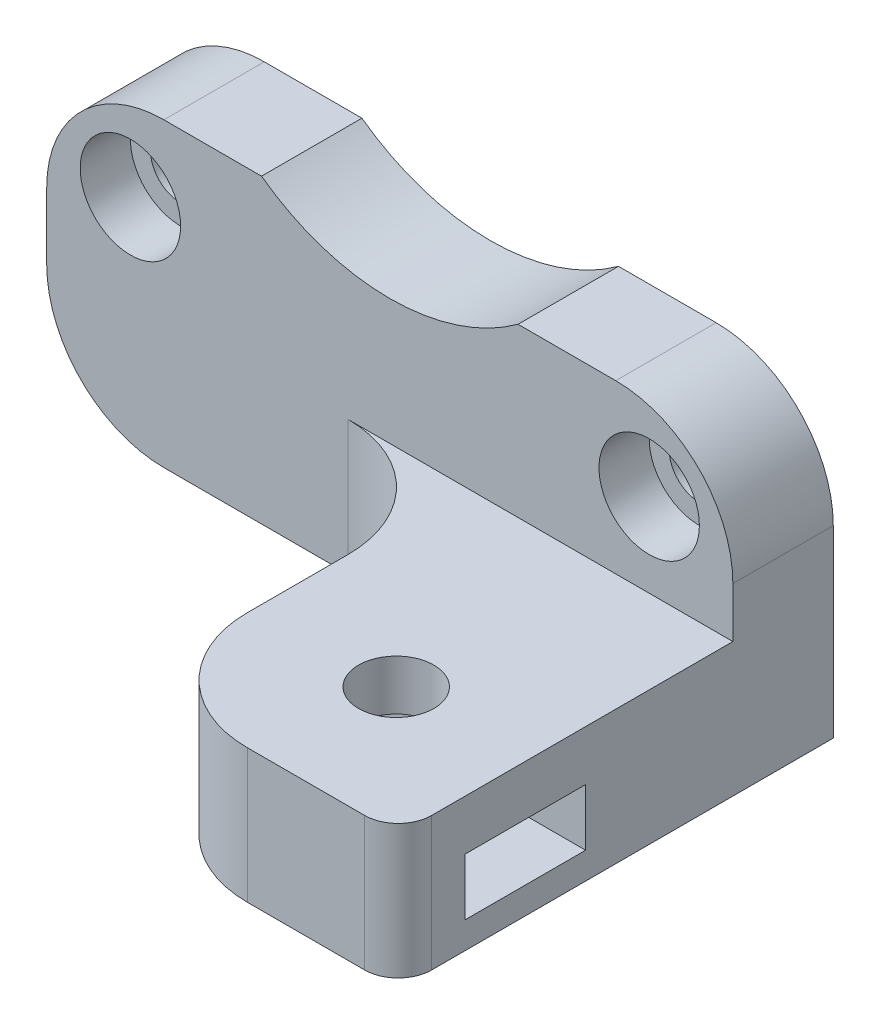
ISO-10303-21;
HEADER;
FILE_DESCRIPTION(('STEP AP214'),'2;1');
FILE_NAME('part.step','',(''),(''),'','','');
FILE_SCHEMA(('AUTOMOTIVE_DESIGN { 1 0 10303 214 1 1 1 1 }'));
ENDSEC;
DATA;
#1=APPLICATION_CONTEXT('core data for automotive mechanical design processes');
#2=APPLICATION_PROTOCOL_DEFINITION('international standard','automotive_design',2000,#1);
#3=PRODUCT_CONTEXT('',#1,'mechanical');
#4=PRODUCT('Part','Part','',(#3));
#5=PRODUCT_RELATED_PRODUCT_CATEGORY('part','',(#4));
#6=PRODUCT_DEFINITION_FORMATION('','',#4);
#7=PRODUCT_DEFINITION_CONTEXT('part definition',#1,'design');
#8=PRODUCT_DEFINITION('design','',#6,#7);
#9=PRODUCT_DEFINITION_SHAPE('','',#8);
#10=(LENGTH_UNIT() NAMED_UNIT(*) SI_UNIT(.MILLI.,.METRE.));
#11=(NAMED_UNIT(*) PLANE_ANGLE_UNIT() SI_UNIT($,.RADIAN.));
#12=(NAMED_UNIT(*) SI_UNIT($,.STERADIAN.) SOLID_ANGLE_UNIT());
#13=UNCERTAINTY_MEASURE_WITH_UNIT(LENGTH_MEASURE(1.E-05),#10,'distance_accuracy_value','');
#14=(GEOMETRIC_REPRESENTATION_CONTEXT(3) GLOBAL_UNCERTAINTY_ASSIGNED_CONTEXT((#13)) GLOBAL_UNIT_ASSIGNED_CONTEXT((#10,
#11,#12)) REPRESENTATION_CONTEXT('',''));
#15=CARTESIAN_POINT('',(0.,0.,0.));
#16=DIRECTION('',(0.,0.,1.));
#17=DIRECTION('',(1.,0.,0.));
#18=AXIS2_PLACEMENT_3D('',#15,#16,#17);
#19=CARTESIAN_POINT('',(41.,0.,0.));
#20=DIRECTION('',(1.,0.,0.));
#21=DIRECTION('',(0.,0.,-1.));
#22=AXIS2_PLACEMENT_3D('',#19,#20,#21);
#23=PLANE('',#22);
#24=DIRECTION('',(0.,-1.,0.));
#25=VECTOR('',#24,1.);
#26=CARTESIAN_POINT('',(41.,10.,-6.));
#27=LINE('',#26,#25);
#28=CARTESIAN_POINT('',(41.,3.,-6.));
#29=VERTEX_POINT('',#28);
#30=CARTESIAN_POINT('',(41.,-8.,-6.));
#31=VERTEX_POINT('',#30);
#32=EDGE_CURVE('E274',#29,#31,#27,.T.);
#33=ORIENTED_EDGE('',*,*,#32,.F.);
#34=DIRECTION('',(0.,0.,-1.));
#35=VECTOR('',#34,1.);
#36=CARTESIAN_POINT('',(41.,3.,0.));
#37=LINE('',#36,#35);
#38=CARTESIAN_POINT('',(41.,3.,0.));
#39=VERTEX_POINT('',#38);
#40=EDGE_CURVE('E340',#29,#39,#37,.F.);
#41=ORIENTED_EDGE('',*,*,#40,.T.);
#42=DIRECTION('',(0.,1.,0.));
#43=VECTOR('',#42,1.);
#44=CARTESIAN_POINT('',(41.,0.,0.));
#45=LINE('',#44,#43);
#46=CARTESIAN_POINT('',(41.,0.,0.));
#47=VERTEX_POINT('',#46);
#48=EDGE_CURVE('E270',#47,#39,#45,.T.);
#49=ORIENTED_EDGE('',*,*,#48,.F.);
#50=DIRECTION('',(0.,0.,-1.));
#51=VECTOR('',#50,1.);
#52=CARTESIAN_POINT('',(41.,0.,20.));
#53=LINE('',#52,#51);
#54=CARTESIAN_POINT('',(41.,0.,18.));
#55=VERTEX_POINT('',#54);
#56=EDGE_CURVE('E268',#55,#47,#53,.T.);
#57=ORIENTED_EDGE('',*,*,#56,.F.);
#58=DIRECTION('',(0.,1.,0.));
#59=VECTOR('',#58,1.);
#60=CARTESIAN_POINT('',(41.,0.,18.));
#61=LINE('',#60,#59);
#62=CARTESIAN_POINT('',(41.,-8.,18.));
#63=VERTEX_POINT('',#62);
#64=EDGE_CURVE('E307',#55,#63,#61,.F.);
#65=ORIENTED_EDGE('',*,*,#64,.T.);
#66=DIRECTION('',(0.,0.,1.));
#67=VECTOR('',#66,1.);
#68=CARTESIAN_POINT('',(41.,-8.,-6.));
#69=LINE('',#68,#67);
#70=EDGE_CURVE('E276',#31,#63,#69,.T.);
#71=ORIENTED_EDGE('',*,*,#70,.F.);
#72=EDGE_LOOP('',(#33,#41,#49,#57,#65,#71));
#73=FACE_BOUND('',#72,.T.);
#74=DIRECTION('',(0.,1.,0.));
#75=VECTOR('',#74,1.);
#76=CARTESIAN_POINT('',(41.,-6.4,8.8));
#77=LINE('',#76,#75);
#78=CARTESIAN_POINT('',(41.,-6.4,8.8));
#79=VERTEX_POINT('',#78);
#80=CARTESIAN_POINT('',(41.,-3.,8.8));
#81=VERTEX_POINT('',#80);
#82=EDGE_CURVE('E227',#79,#81,#77,.T.);
#83=ORIENTED_EDGE('',*,*,#82,.F.);
#84=DIRECTION('',(0.,0.,-1.));
#85=VECTOR('',#84,1.);
#86=CARTESIAN_POINT('',(41.,-6.4,0.));
#87=LINE('',#86,#85);
#88=CARTESIAN_POINT('',(41.,-6.4,16.));
#89=VERTEX_POINT('',#88);
#90=EDGE_CURVE('E191',#89,#79,#87,.T.);
#91=ORIENTED_EDGE('',*,*,#90,.F.);
#92=DIRECTION('',(0.,1.,0.));
#93=VECTOR('',#92,1.);
#94=CARTESIAN_POINT('',(41.,-6.4,16.));
#95=LINE('',#94,#93);
#96=CARTESIAN_POINT('',(41.,-3.,16.));
#97=VERTEX_POINT('',#96);
#98=EDGE_CURVE('E181',#89,#97,#95,.T.);
#99=ORIENTED_EDGE('',*,*,#98,.T.);
#100=DIRECTION('',(0.,0.,-1.));
#101=VECTOR('',#100,1.);
#102=CARTESIAN_POINT('',(41.,-3.,0.));
#103=LINE('',#102,#101);
#104=EDGE_CURVE('E214',#97,#81,#103,.T.);
#105=ORIENTED_EDGE('',*,*,#104,.T.);
#106=EDGE_LOOP('',(#83,#91,#99,#105));
#107=FACE_BOUND('',#106,.T.);
#108=ADVANCED_FACE('F33',(#73,#107),#23,.T.);
#109=CARTESIAN_POINT('',(33.2837910699482,0.,12.4));
#110=DIRECTION('',(0.,1.,0.));
#111=DIRECTION('',(0.,0.,1.));
#112=AXIS2_PLACEMENT_3D('',#109,#110,#111);
#113=CYLINDRICAL_SURFACE('',#112,2.25);
#114=CARTESIAN_POINT('',(33.2837910699482,-8.,12.4));
#115=DIRECTION('',(0.,1.,0.));
#116=DIRECTION('',(0.,0.,1.));
#117=AXIS2_PLACEMENT_3D('',#114,#115,#116);
#118=CIRCLE('',#117,2.25);
#119=CARTESIAN_POINT('',(33.2837910699482,-8.,14.65));
#120=VERTEX_POINT('',#119);
#121=EDGE_CURVE('E247',#120,#120,#118,.T.);
#122=ORIENTED_EDGE('',*,*,#121,.F.);
#123=EDGE_LOOP('',(#122));
#124=FACE_BOUND('',#123,.T.);
#125=CARTESIAN_POINT('',(33.2837910699482,-6.4,12.4));
#126=DIRECTION('',(0.,1.,0.));
#127=DIRECTION('',(0.,0.,1.));
#128=AXIS2_PLACEMENT_3D('',#125,#126,#127);
#129=CIRCLE('',#128,2.25);
#130=CARTESIAN_POINT('',(33.2837910699482,-6.4,14.65));
#131=VERTEX_POINT('',#130);
#132=EDGE_CURVE('E196',#131,#131,#129,.F.);
#133=ORIENTED_EDGE('',*,*,#132,.F.);
#134=EDGE_LOOP('',(#133));
#135=FACE_BOUND('',#134,.T.);
#136=ADVANCED_FACE('F418',(#124,#135),#113,.F.);
#137=CARTESIAN_POINT('',(36.0000000000001,5.00000000000001,-6.));
#138=DIRECTION('',(0.,0.,1.));
#139=DIRECTION('',(1.,0.,0.));
#140=AXIS2_PLACEMENT_3D('',#137,#138,#139);
#141=CYLINDRICAL_SURFACE('',#140,1.8);
#142=CARTESIAN_POINT('',(36.0000000000001,5.00000000000001,-6.));
#143=DIRECTION('',(0.,0.,1.));
#144=DIRECTION('',(1.,0.,0.));
#145=AXIS2_PLACEMENT_3D('',#142,#143,#144);
#146=CIRCLE('',#145,1.8);
#147=CARTESIAN_POINT('',(37.8000000000001,5.00000000000001,-6.));
#148=VERTEX_POINT('',#147);
#149=EDGE_CURVE('E251',#148,#148,#146,.T.);
#150=ORIENTED_EDGE('',*,*,#149,.F.);
#151=EDGE_LOOP('',(#150));
#152=FACE_BOUND('',#151,.T.);
#153=CARTESIAN_POINT('',(36.0000000000001,5.00000000000001,-3.));
#154=DIRECTION('',(0.,0.,1.));
#155=DIRECTION('',(1.,0.,0.));
#156=AXIS2_PLACEMENT_3D('',#153,#154,#155);
#157=CIRCLE('',#156,1.8);
#158=CARTESIAN_POINT('',(37.8000000000001,5.00000000000001,-3.));
#159=VERTEX_POINT('',#158);
#160=EDGE_CURVE('E234',#159,#159,#157,.F.);
#161=ORIENTED_EDGE('',*,*,#160,.F.);
#162=EDGE_LOOP('',(#161));
#163=FACE_BOUND('',#162,.T.);
#164=ADVANCED_FACE('F398',(#152,#163),#141,.F.);
#165=CARTESIAN_POINT('',(5.00000000000006,5.00000000000001,-6.));
#166=DIRECTION('',(0.,0.,1.));
#167=DIRECTION('',(1.,0.,0.));
#168=AXIS2_PLACEMENT_3D('',#165,#166,#167);
#169=CYLINDRICAL_SURFACE('',#168,1.8);
#170=CARTESIAN_POINT('',(5.00000000000006,5.00000000000001,-6.));
#171=DIRECTION('',(0.,0.,1.));
#172=DIRECTION('',(1.,0.,0.));
#173=AXIS2_PLACEMENT_3D('',#170,#171,#172);
#174=CIRCLE('',#173,1.8);
#175=CARTESIAN_POINT('',(6.80000000000006,5.00000000000001,-6.));
#176=VERTEX_POINT('',#175);
#177=EDGE_CURVE('E264',#176,#176,#174,.T.);
#178=ORIENTED_EDGE('',*,*,#177,.F.);
#179=EDGE_LOOP('',(#178));
#180=FACE_BOUND('',#179,.T.);
#181=CARTESIAN_POINT('',(5.00000000000006,5.00000000000001,-3.));
#182=DIRECTION('',(0.,0.,1.));
#183=DIRECTION('',(1.,0.,0.));
#184=AXIS2_PLACEMENT_3D('',#181,#182,#183);
#185=CIRCLE('',#184,1.8);
#186=CARTESIAN_POINT('',(6.80000000000006,5.00000000000001,-3.));
#187=VERTEX_POINT('',#186);
#188=EDGE_CURVE('E240',#187,#187,#185,.F.);
#189=ORIENTED_EDGE('',*,*,#188,.F.);
#190=EDGE_LOOP('',(#189));
#191=FACE_BOUND('',#190,.T.);
#192=ADVANCED_FACE('F394',(#180,#191),#169,.F.);
#193=CARTESIAN_POINT('',(41.,10.,0.));
#194=DIRECTION('',(0.,1.,0.));
#195=DIRECTION('',(0.,0.,1.));
#196=AXIS2_PLACEMENT_3D('',#193,#194,#195);
#197=PLANE('',#196);
#198=DIRECTION('',(-1.,0.,0.));
#199=VECTOR('',#198,1.);
#200=CARTESIAN_POINT('',(41.,10.,-6.));
#201=LINE('',#200,#199);
#202=CARTESIAN_POINT('',(12.8351451416208,10.,-6.));
#203=VERTEX_POINT('',#202);
#204=CARTESIAN_POINT('',(7.,10.,-6.));
#205=VERTEX_POINT('',#204);
#206=EDGE_CURVE('E294',#203,#205,#201,.T.);
#207=ORIENTED_EDGE('',*,*,#206,.T.);
#208=DIRECTION('',(0.,0.,-1.));
#209=VECTOR('',#208,1.);
#210=CARTESIAN_POINT('',(7.,10.,0.));
#211=LINE('',#210,#209);
#212=CARTESIAN_POINT('',(7.,10.,0.));
#213=VERTEX_POINT('',#212);
#214=EDGE_CURVE('E348',#205,#213,#211,.F.);
#215=ORIENTED_EDGE('',*,*,#214,.T.);
#216=DIRECTION('',(-1.,0.,0.));
#217=VECTOR('',#216,1.);
#218=CARTESIAN_POINT('',(41.,10.,0.));
#219=LINE('',#218,#217);
#220=CARTESIAN_POINT('',(12.8351451416208,10.,0.));
#221=VERTEX_POINT('',#220);
#222=EDGE_CURVE('E297',#221,#213,#219,.T.);
#223=ORIENTED_EDGE('',*,*,#222,.F.);
#224=DIRECTION('',(0.,0.,1.));
#225=VECTOR('',#224,1.);
#226=CARTESIAN_POINT('',(12.8351451416208,10.,-6.));
#227=LINE('',#226,#225);
#228=EDGE_CURVE('E262',#203,#221,#227,.T.);
#229=ORIENTED_EDGE('',*,*,#228,.F.);
#230=EDGE_LOOP('',(#207,#215,#223,#229));
#231=FACE_BOUND('',#230,.T.);
#232=ADVANCED_FACE('F397',(#231),#197,.T.);
#233=CARTESIAN_POINT('',(41.,0.,20.));
#234=DIRECTION('',(0.,1.,0.));
#235=DIRECTION('',(0.,0.,1.));
#236=AXIS2_PLACEMENT_3D('',#233,#234,#235);
#237=PLANE('',#236);
#238=DIRECTION('',(0.,0.,-1.));
#239=VECTOR('',#238,1.);
#240=CARTESIAN_POINT('',(25.,0.,0.));
#241=LINE('',#240,#239);
#242=CARTESIAN_POINT('',(25.,0.,13.));
#243=VERTEX_POINT('',#242);
#244=CARTESIAN_POINT('',(25.,0.,7.));
#245=VERTEX_POINT('',#244);
#246=EDGE_CURVE('E355',#243,#245,#241,.T.);
#247=ORIENTED_EDGE('',*,*,#246,.F.);
#248=CARTESIAN_POINT('',(32.,0.,13.));
#249=DIRECTION('',(0.,1.,0.));
#250=DIRECTION('',(0.,0.,1.));
#251=AXIS2_PLACEMENT_3D('',#248,#249,#250);
#252=CIRCLE('',#251,7.);
#253=CARTESIAN_POINT('',(32.,0.,20.));
#254=VERTEX_POINT('',#253);
#255=EDGE_CURVE('E325',#243,#254,#252,.T.);
#256=ORIENTED_EDGE('',*,*,#255,.T.);
#257=DIRECTION('',(-1.,0.,0.));
#258=VECTOR('',#257,1.);
#259=CARTESIAN_POINT('',(41.,0.,20.));
#260=LINE('',#259,#258);
#261=CARTESIAN_POINT('',(39.,0.,20.));
#262=VERTEX_POINT('',#261);
#263=EDGE_CURVE('E283',#262,#254,#260,.T.);
#264=ORIENTED_EDGE('',*,*,#263,.F.);
#265=CARTESIAN_POINT('',(39.,0.,18.));
#266=DIRECTION('',(0.,1.,0.));
#267=DIRECTION('',(0.,0.,1.));
#268=AXIS2_PLACEMENT_3D('',#265,#266,#267);
#269=CIRCLE('',#268,2.);
#270=EDGE_CURVE('E305',#262,#55,#269,.T.);
#271=ORIENTED_EDGE('',*,*,#270,.T.);
#272=ORIENTED_EDGE('',*,*,#56,.T.);
#273=DIRECTION('',(-1.,0.,0.));
#274=VECTOR('',#273,1.);
#275=CARTESIAN_POINT('',(41.,0.,0.));
#276=LINE('',#275,#274);
#277=CARTESIAN_POINT('',(18.,0.,0.));
#278=VERTEX_POINT('',#277);
#279=EDGE_CURVE('E279',#47,#278,#276,.T.);
#280=ORIENTED_EDGE('',*,*,#279,.T.);
#281=CARTESIAN_POINT('',(18.,0.,7.));
#282=DIRECTION('',(0.,1.,0.));
#283=DIRECTION('',(0.,0.,1.));
#284=AXIS2_PLACEMENT_3D('',#281,#282,#283);
#285=CIRCLE('',#284,7.);
#286=EDGE_CURVE('E41',#278,#245,#285,.F.);
#287=ORIENTED_EDGE('',*,*,#286,.T.);
#288=EDGE_LOOP('',(#247,#256,#264,#271,#272,#280,#287));
#289=FACE_BOUND('',#288,.T.);
#290=CARTESIAN_POINT('',(33.2837910699482,0.,12.4));
#291=DIRECTION('',(0.,1.,0.));
#292=DIRECTION('',(0.,0.,1.));
#293=AXIS2_PLACEMENT_3D('',#290,#291,#292);
#294=CIRCLE('',#293,2.25);
#295=CARTESIAN_POINT('',(33.2837910699482,0.,14.65));
#296=VERTEX_POINT('',#295);
#297=EDGE_CURVE('E244',#296,#296,#294,.T.);
#298=ORIENTED_EDGE('',*,*,#297,.F.);
#299=EDGE_LOOP('',(#298));
#300=FACE_BOUND('',#299,.T.);
#301=ADVANCED_FACE('F353',(#289,#300),#237,.T.);
#302=CARTESIAN_POINT('',(41.,-8.,20.));
#303=DIRECTION('',(0.,0.,1.));
#304=DIRECTION('',(1.,0.,0.));
#305=AXIS2_PLACEMENT_3D('',#302,#303,#304);
#306=PLANE('',#305);
#307=ORIENTED_EDGE('',*,*,#263,.T.);
#308=DIRECTION('',(0.,1.,0.));
#309=VECTOR('',#308,1.);
#310=CARTESIAN_POINT('',(32.,-8.,20.));
#311=LINE('',#310,#309);
#312=CARTESIAN_POINT('',(32.,-8.,20.));
#313=VERTEX_POINT('',#312);
#314=EDGE_CURVE('E327',#254,#313,#311,.F.);
#315=ORIENTED_EDGE('',*,*,#314,.T.);
#316=DIRECTION('',(-1.,0.,0.));
#317=VECTOR('',#316,1.);
#318=CARTESIAN_POINT('',(41.,-8.,20.));
#319=LINE('',#318,#317);
#320=CARTESIAN_POINT('',(39.,-8.,20.));
#321=VERTEX_POINT('',#320);
#322=EDGE_CURVE('E287',#321,#313,#319,.T.);
#323=ORIENTED_EDGE('',*,*,#322,.F.);
#324=DIRECTION('',(0.,1.,0.));
#325=VECTOR('',#324,1.);
#326=CARTESIAN_POINT('',(39.,-8.,20.));
#327=LINE('',#326,#325);
#328=EDGE_CURVE('E286',#321,#262,#327,.T.);
#329=ORIENTED_EDGE('',*,*,#328,.T.);
#330=EDGE_LOOP('',(#307,#315,#323,#329));
#331=FACE_BOUND('',#330,.T.);
#332=ADVANCED_FACE('F433',(#331),#306,.T.);
#333=CARTESIAN_POINT('',(41.,-8.,-6.));
#334=DIRECTION('',(0.,-1.,0.));
#335=DIRECTION('',(0.,0.,-1.));
#336=AXIS2_PLACEMENT_3D('',#333,#334,#335);
#337=PLANE('',#336);
#338=ORIENTED_EDGE('',*,*,#322,.T.);
#339=CARTESIAN_POINT('',(32.,-8.,13.));
#340=DIRECTION('',(0.,-1.,0.));
#341=DIRECTION('',(0.,0.,-1.));
#342=AXIS2_PLACEMENT_3D('',#339,#340,#341);
#343=CIRCLE('',#342,7.);
#344=CARTESIAN_POINT('',(25.,-8.,13.));
#345=VERTEX_POINT('',#344);
#346=EDGE_CURVE('E331',#313,#345,#343,.T.);
#347=ORIENTED_EDGE('',*,*,#346,.T.);
#348=DIRECTION('',(0.,0.,-1.));
#349=VECTOR('',#348,1.);
#350=CARTESIAN_POINT('',(25.,-8.,0.));
#351=LINE('',#350,#349);
#352=CARTESIAN_POINT('',(25.,-8.,7.));
#353=VERTEX_POINT('',#352);
#354=EDGE_CURVE('E365',#345,#353,#351,.T.);
#355=ORIENTED_EDGE('',*,*,#354,.T.);
#356=CARTESIAN_POINT('',(18.,-8.,7.));
#357=DIRECTION('',(0.,-1.,0.));
#358=DIRECTION('',(0.,0.,-1.));
#359=AXIS2_PLACEMENT_3D('',#356,#357,#358);
#360=CIRCLE('',#359,7.);
#361=CARTESIAN_POINT('',(18.,-8.,0.));
#362=VERTEX_POINT('',#361);
#363=EDGE_CURVE('E11',#353,#362,#360,.F.);
#364=ORIENTED_EDGE('',*,*,#363,.T.);
#365=DIRECTION('',(-1.,0.,0.));
#366=VECTOR('',#365,1.);
#367=CARTESIAN_POINT('',(0.,-8.,0.));
#368=LINE('',#367,#366);
#369=CARTESIAN_POINT('',(7.,-8.,0.));
#370=VERTEX_POINT('',#369);
#371=EDGE_CURVE('E210',#362,#370,#368,.T.);
#372=ORIENTED_EDGE('',*,*,#371,.T.);
#373=DIRECTION('',(0.,0.,1.));
#374=VECTOR('',#373,1.);
#375=CARTESIAN_POINT('',(7.,-8.,-6.));
#376=LINE('',#375,#374);
#377=CARTESIAN_POINT('',(7.,-8.,-6.));
#378=VERTEX_POINT('',#377);
#379=EDGE_CURVE('E329',#370,#378,#376,.F.);
#380=ORIENTED_EDGE('',*,*,#379,.T.);
#381=DIRECTION('',(-1.,0.,0.));
#382=VECTOR('',#381,1.);
#383=CARTESIAN_POINT('',(41.,-8.,-6.));
#384=LINE('',#383,#382);
#385=EDGE_CURVE('E290',#31,#378,#384,.T.);
#386=ORIENTED_EDGE('',*,*,#385,.F.);
#387=ORIENTED_EDGE('',*,*,#70,.T.);
#388=CARTESIAN_POINT('',(39.,-8.,18.));
#389=DIRECTION('',(0.,-1.,0.));
#390=DIRECTION('',(0.,0.,-1.));
#391=AXIS2_PLACEMENT_3D('',#388,#389,#390);
#392=CIRCLE('',#391,2.);
#393=EDGE_CURVE('E309',#63,#321,#392,.T.);
#394=ORIENTED_EDGE('',*,*,#393,.T.);
#395=EDGE_LOOP('',(#338,#347,#355,#364,#372,#380,#386,#387,#394));
#396=FACE_BOUND('',#395,.T.);
#397=ORIENTED_EDGE('',*,*,#121,.T.);
#398=EDGE_LOOP('',(#397));
#399=FACE_BOUND('',#398,.T.);
#400=ADVANCED_FACE('F371',(#396,#399),#337,.T.);
#401=CARTESIAN_POINT('',(41.,10.,-6.));
#402=DIRECTION('',(0.,0.,-1.));
#403=DIRECTION('',(0.,1.,0.));
#404=AXIS2_PLACEMENT_3D('',#401,#402,#403);
#405=PLANE('',#404);
#406=ORIENTED_EDGE('',*,*,#149,.T.);
#407=EDGE_LOOP('',(#406));
#408=FACE_BOUND('',#407,.T.);
#409=CARTESIAN_POINT('',(34.,10.,-6.));
#410=VERTEX_POINT('',#409);
#411=CARTESIAN_POINT('',(28.1648548583794,10.,-6.));
#412=VERTEX_POINT('',#411);
#413=EDGE_CURVE('E292',#410,#412,#201,.T.);
#414=ORIENTED_EDGE('',*,*,#413,.F.);
#415=CARTESIAN_POINT('',(34.,3.,-6.));
#416=DIRECTION('',(0.,0.,-1.));
#417=DIRECTION('',(0.,1.,0.));
#418=AXIS2_PLACEMENT_3D('',#415,#416,#417);
#419=CIRCLE('',#418,7.);
#420=EDGE_CURVE('E338',#410,#29,#419,.T.);
#421=ORIENTED_EDGE('',*,*,#420,.T.);
#422=ORIENTED_EDGE('',*,*,#32,.T.);
#423=ORIENTED_EDGE('',*,*,#385,.T.);
#424=CARTESIAN_POINT('',(7.,-0.999999999999997,-6.));
#425=DIRECTION('',(0.,0.,-1.));
#426=DIRECTION('',(0.,1.,0.));
#427=AXIS2_PLACEMENT_3D('',#424,#425,#426);
#428=CIRCLE('',#427,7.);
#429=CARTESIAN_POINT('',(0.,-0.999999999999996,-6.));
#430=VERTEX_POINT('',#429);
#431=EDGE_CURVE('E54',#378,#430,#428,.T.);
#432=ORIENTED_EDGE('',*,*,#431,.T.);
#433=DIRECTION('',(0.,-1.,0.));
#434=VECTOR('',#433,1.);
#435=CARTESIAN_POINT('',(0.,10.,-6.));
#436=LINE('',#435,#434);
#437=CARTESIAN_POINT('',(0.,3.,-6.));
#438=VERTEX_POINT('',#437);
#439=EDGE_CURVE('E271',#438,#430,#436,.T.);
#440=ORIENTED_EDGE('',*,*,#439,.F.);
#441=CARTESIAN_POINT('',(7.,3.,-6.));
#442=DIRECTION('',(0.,0.,-1.));
#443=DIRECTION('',(0.,1.,0.));
#444=AXIS2_PLACEMENT_3D('',#441,#442,#443);
#445=CIRCLE('',#444,7.);
#446=EDGE_CURVE('E48',#438,#205,#445,.T.);
#447=ORIENTED_EDGE('',*,*,#446,.T.);
#448=ORIENTED_EDGE('',*,*,#206,.F.);
#449=CARTESIAN_POINT('',(20.5000000000001,20.499999999999,-6.));
#450=DIRECTION('',(0.,0.,1.));
#451=DIRECTION('',(1.,0.,0.));
#452=AXIS2_PLACEMENT_3D('',#449,#450,#451);
#453=CIRCLE('',#452,13.);
#454=EDGE_CURVE('E250',#203,#412,#453,.T.);
#455=ORIENTED_EDGE('',*,*,#454,.T.);
#456=EDGE_LOOP('',(#414,#421,#422,#423,#432,#440,#447,#448,#455));
#457=FACE_BOUND('',#456,.T.);
#458=ORIENTED_EDGE('',*,*,#177,.T.);
#459=EDGE_LOOP('',(#458));
#460=FACE_BOUND('',#459,.T.);
#461=ADVANCED_FACE('F386',(#408,#457,#460),#405,.T.);
#462=CARTESIAN_POINT('',(34.,10.,0.));
#463=VERTEX_POINT('',#462);
#464=CARTESIAN_POINT('',(28.1648548583794,10.,0.));
#465=VERTEX_POINT('',#464);
#466=EDGE_CURVE('E295',#463,#465,#219,.T.);
#467=ORIENTED_EDGE('',*,*,#466,.F.);
#468=DIRECTION('',(0.,0.,-1.));
#469=VECTOR('',#468,1.);
#470=CARTESIAN_POINT('',(34.,10.,0.));
#471=LINE('',#470,#469);
#472=EDGE_CURVE('E333',#463,#410,#471,.T.);
#473=ORIENTED_EDGE('',*,*,#472,.T.);
#474=ORIENTED_EDGE('',*,*,#413,.T.);
#475=DIRECTION('',(0.,0.,1.));
#476=VECTOR('',#475,1.);
#477=CARTESIAN_POINT('',(28.1648548583794,10.,-6.));
#478=LINE('',#477,#476);
#479=EDGE_CURVE('E254',#465,#412,#478,.F.);
#480=ORIENTED_EDGE('',*,*,#479,.F.);
#481=EDGE_LOOP('',(#467,#473,#474,#480));
#482=FACE_BOUND('',#481,.T.);
#483=ADVANCED_FACE('F389',(#482),#197,.T.);
#484=CARTESIAN_POINT('',(41.,0.,0.));
#485=DIRECTION('',(0.,0.,1.));
#486=DIRECTION('',(1.,0.,0.));
#487=AXIS2_PLACEMENT_3D('',#484,#485,#486);
#488=PLANE('',#487);
#489=CARTESIAN_POINT('',(36.0000000000001,5.00000000000001,0.));
#490=DIRECTION('',(0.,0.,1.));
#491=DIRECTION('',(1.,0.,0.));
#492=AXIS2_PLACEMENT_3D('',#489,#490,#491);
#493=CIRCLE('',#492,3.);
#494=CARTESIAN_POINT('',(39.0000000000001,5.00000000000001,0.));
#495=VERTEX_POINT('',#494);
#496=EDGE_CURVE('E224',#495,#495,#493,.T.);
#497=ORIENTED_EDGE('',*,*,#496,.F.);
#498=EDGE_LOOP('',(#497));
#499=FACE_BOUND('',#498,.T.);
#500=CARTESIAN_POINT('',(5.00000000000006,5.00000000000001,0.));
#501=DIRECTION('',(0.,0.,1.));
#502=DIRECTION('',(1.,0.,0.));
#503=AXIS2_PLACEMENT_3D('',#500,#501,#502);
#504=CIRCLE('',#503,3.);
#505=CARTESIAN_POINT('',(8.00000000000006,5.00000000000001,0.));
#506=VERTEX_POINT('',#505);
#507=EDGE_CURVE('E241',#506,#506,#504,.T.);
#508=ORIENTED_EDGE('',*,*,#507,.F.);
#509=EDGE_LOOP('',(#508));
#510=FACE_BOUND('',#509,.T.);
#511=ORIENTED_EDGE('',*,*,#371,.F.);
#512=DIRECTION('',(0.,1.,0.));
#513=VECTOR('',#512,1.);
#514=CARTESIAN_POINT('',(18.,0.,0.));
#515=LINE('',#514,#513);
#516=EDGE_CURVE('E317',#362,#278,#515,.T.);
#517=ORIENTED_EDGE('',*,*,#516,.T.);
#518=ORIENTED_EDGE('',*,*,#279,.F.);
#519=ORIENTED_EDGE('',*,*,#48,.T.);
#520=CARTESIAN_POINT('',(34.,3.,0.));
#521=DIRECTION('',(0.,0.,1.));
#522=DIRECTION('',(1.,0.,0.));
#523=AXIS2_PLACEMENT_3D('',#520,#521,#522);
#524=CIRCLE('',#523,7.);
#525=EDGE_CURVE('E315',#39,#463,#524,.T.);
#526=ORIENTED_EDGE('',*,*,#525,.T.);
#527=ORIENTED_EDGE('',*,*,#466,.T.);
#528=CARTESIAN_POINT('',(20.5000000000001,20.499999999999,0.));
#529=DIRECTION('',(0.,0.,1.));
#530=DIRECTION('',(1.,0.,0.));
#531=AXIS2_PLACEMENT_3D('',#528,#529,#530);
#532=CIRCLE('',#531,13.);
#533=EDGE_CURVE('E255',#221,#465,#532,.T.);
#534=ORIENTED_EDGE('',*,*,#533,.F.);
#535=ORIENTED_EDGE('',*,*,#222,.T.);
#536=CARTESIAN_POINT('',(7.,3.,0.));
#537=DIRECTION('',(0.,0.,1.));
#538=DIRECTION('',(1.,0.,0.));
#539=AXIS2_PLACEMENT_3D('',#536,#537,#538);
#540=CIRCLE('',#539,7.);
#541=CARTESIAN_POINT('',(0.,3.,0.));
#542=VERTEX_POINT('',#541);
#543=EDGE_CURVE('E311',#213,#542,#540,.T.);
#544=ORIENTED_EDGE('',*,*,#543,.T.);
#545=DIRECTION('',(0.,1.,0.));
#546=VECTOR('',#545,1.);
#547=CARTESIAN_POINT('',(0.,0.,0.));
#548=LINE('',#547,#546);
#549=CARTESIAN_POINT('',(0.,-0.999999999999997,0.));
#550=VERTEX_POINT('',#549);
#551=EDGE_CURVE('E267',#550,#542,#548,.T.);
#552=ORIENTED_EDGE('',*,*,#551,.F.);
#553=CARTESIAN_POINT('',(7.,-0.999999999999997,0.));
#554=DIRECTION('',(0.,0.,1.));
#555=DIRECTION('',(1.,0.,0.));
#556=AXIS2_PLACEMENT_3D('',#553,#554,#555);
#557=CIRCLE('',#556,7.);
#558=EDGE_CURVE('E313',#550,#370,#557,.T.);
#559=ORIENTED_EDGE('',*,*,#558,.T.);
#560=EDGE_LOOP('',(#511,#517,#518,#519,#526,#527,#534,#535,#544,#552,#559));
#561=FACE_BOUND('',#560,.T.);
#562=ADVANCED_FACE('F375',(#499,#510,#561),#488,.T.);
#563=CARTESIAN_POINT('',(0.,0.,0.));
#564=DIRECTION('',(1.,0.,0.));
#565=DIRECTION('',(0.,0.,-1.));
#566=AXIS2_PLACEMENT_3D('',#563,#564,#565);
#567=PLANE('',#566);
#568=ORIENTED_EDGE('',*,*,#439,.T.);
#569=DIRECTION('',(0.,0.,1.));
#570=VECTOR('',#569,1.);
#571=CARTESIAN_POINT('',(0.,-0.999999999999997,0.));
#572=LINE('',#571,#570);
#573=EDGE_CURVE('E345',#430,#550,#572,.T.);
#574=ORIENTED_EDGE('',*,*,#573,.T.);
#575=ORIENTED_EDGE('',*,*,#551,.T.);
#576=DIRECTION('',(0.,0.,-1.));
#577=VECTOR('',#576,1.);
#578=CARTESIAN_POINT('',(0.,3.,-6.));
#579=LINE('',#578,#577);
#580=EDGE_CURVE('E342',#542,#438,#579,.T.);
#581=ORIENTED_EDGE('',*,*,#580,.T.);
#582=EDGE_LOOP('',(#568,#574,#575,#581));
#583=FACE_BOUND('',#582,.T.);
#584=ADVANCED_FACE('F383',(#583),#567,.F.);
#585=CARTESIAN_POINT('',(20.5000000000001,20.499999999999,-6.));
#586=DIRECTION('',(0.,0.,1.));
#587=DIRECTION('',(1.,0.,0.));
#588=AXIS2_PLACEMENT_3D('',#585,#586,#587);
#589=CYLINDRICAL_SURFACE('',#588,13.);
#590=ORIENTED_EDGE('',*,*,#228,.T.);
#591=ORIENTED_EDGE('',*,*,#533,.T.);
#592=ORIENTED_EDGE('',*,*,#479,.T.);
#593=ORIENTED_EDGE('',*,*,#454,.F.);
#594=EDGE_LOOP('',(#590,#591,#592,#593));
#595=FACE_BOUND('',#594,.T.);
#596=ADVANCED_FACE('F415',(#595),#589,.F.);
#597=CARTESIAN_POINT('',(33.2837910699482,-3.,12.4));
#598=DIRECTION('',(0.,1.,0.));
#599=DIRECTION('',(0.,0.,1.));
#600=AXIS2_PLACEMENT_3D('',#597,#598,#599);
#601=CIRCLE('',#600,2.25);
#602=CARTESIAN_POINT('',(33.2837910699482,-3.,14.65));
#603=VERTEX_POINT('',#602);
#604=EDGE_CURVE('E207',#603,#603,#601,.F.);
#605=ORIENTED_EDGE('',*,*,#604,.T.);
#606=EDGE_LOOP('',(#605));
#607=FACE_BOUND('',#606,.T.);
#608=ORIENTED_EDGE('',*,*,#297,.T.);
#609=EDGE_LOOP('',(#608));
#610=FACE_BOUND('',#609,.T.);
#611=ADVANCED_FACE('F405',(#607,#610),#113,.F.);
#612=CARTESIAN_POINT('',(5.00000000000006,5.00000000000001,-3.));
#613=DIRECTION('',(0.,0.,1.));
#614=DIRECTION('',(1.,0.,0.));
#615=AXIS2_PLACEMENT_3D('',#612,#613,#614);
#616=PLANE('',#615);
#617=CARTESIAN_POINT('',(5.00000000000006,5.00000000000001,-3.));
#618=DIRECTION('',(0.,0.,1.));
#619=DIRECTION('',(1.,0.,0.));
#620=AXIS2_PLACEMENT_3D('',#617,#618,#619);
#621=CIRCLE('',#620,3.);
#622=CARTESIAN_POINT('',(8.00000000000006,5.00000000000001,-3.));
#623=VERTEX_POINT('',#622);
#624=EDGE_CURVE('E237',#623,#623,#621,.T.);
#625=ORIENTED_EDGE('',*,*,#624,.T.);
#626=EDGE_LOOP('',(#625));
#627=FACE_BOUND('',#626,.T.);
#628=ORIENTED_EDGE('',*,*,#188,.T.);
#629=EDGE_LOOP('',(#628));
#630=FACE_BOUND('',#629,.T.);
#631=ADVANCED_FACE('F402',(#627,#630),#616,.T.);
#632=CARTESIAN_POINT('',(5.00000000000006,5.00000000000001,-3.));
#633=DIRECTION('',(0.,0.,1.));
#634=DIRECTION('',(1.,0.,0.));
#635=AXIS2_PLACEMENT_3D('',#632,#633,#634);
#636=CYLINDRICAL_SURFACE('',#635,3.);
#637=ORIENTED_EDGE('',*,*,#624,.F.);
#638=EDGE_LOOP('',(#637));
#639=FACE_BOUND('',#638,.T.);
#640=ORIENTED_EDGE('',*,*,#507,.T.);
#641=EDGE_LOOP('',(#640));
#642=FACE_BOUND('',#641,.T.);
#643=ADVANCED_FACE('F404',(#639,#642),#636,.F.);
#644=CARTESIAN_POINT('',(36.0000000000001,5.00000000000001,-3.));
#645=DIRECTION('',(0.,0.,1.));
#646=DIRECTION('',(1.,0.,0.));
#647=AXIS2_PLACEMENT_3D('',#644,#645,#646);
#648=PLANE('',#647);
#649=CARTESIAN_POINT('',(36.0000000000001,5.00000000000001,-3.));
#650=DIRECTION('',(0.,0.,1.));
#651=DIRECTION('',(1.,0.,0.));
#652=AXIS2_PLACEMENT_3D('',#649,#650,#651);
#653=CIRCLE('',#652,3.);
#654=CARTESIAN_POINT('',(39.0000000000001,5.00000000000001,-3.));
#655=VERTEX_POINT('',#654);
#656=EDGE_CURVE('E231',#655,#655,#653,.T.);
#657=ORIENTED_EDGE('',*,*,#656,.T.);
#658=EDGE_LOOP('',(#657));
#659=FACE_BOUND('',#658,.T.);
#660=ORIENTED_EDGE('',*,*,#160,.T.);
#661=EDGE_LOOP('',(#660));
#662=FACE_BOUND('',#661,.T.);
#663=ADVANCED_FACE('F412',(#659,#662),#648,.T.);
#664=CARTESIAN_POINT('',(36.0000000000001,5.00000000000001,-3.));
#665=DIRECTION('',(0.,0.,1.));
#666=DIRECTION('',(1.,0.,0.));
#667=AXIS2_PLACEMENT_3D('',#664,#665,#666);
#668=CYLINDRICAL_SURFACE('',#667,3.);
#669=ORIENTED_EDGE('',*,*,#656,.F.);
#670=EDGE_LOOP('',(#669));
#671=FACE_BOUND('',#670,.T.);
#672=ORIENTED_EDGE('',*,*,#496,.T.);
#673=EDGE_LOOP('',(#672));
#674=FACE_BOUND('',#673,.T.);
#675=ADVANCED_FACE('F505',(#671,#674),#668,.F.);
#676=CARTESIAN_POINT('',(14.6757943453737,-6.4,-8.47307381587307));
#677=DIRECTION('',(-0.866025403784439,0.,0.5));
#678=DIRECTION('',(0.5,0.,0.866025403784439));
#679=AXIS2_PLACEMENT_3D('',#676,#677,#678);
#680=PLANE('',#679);
#681=DIRECTION('',(0.5,0.,0.866025403784439));
#682=VECTOR('',#681,1.);
#683=CARTESIAN_POINT('',(14.6757943453737,-3.,-8.47307381587307));
#684=LINE('',#683,#682);
#685=CARTESIAN_POINT('',(26.7268691317829,-3.,12.4));
#686=VERTEX_POINT('',#685);
#687=CARTESIAN_POINT('',(28.8053301008656,-3.,16.));
#688=VERTEX_POINT('',#687);
#689=EDGE_CURVE('E177',#686,#688,#684,.T.);
#690=ORIENTED_EDGE('',*,*,#689,.T.);
#691=DIRECTION('',(0.,1.,0.));
#692=VECTOR('',#691,1.);
#693=CARTESIAN_POINT('',(28.8053301008656,-6.4,16.));
#694=LINE('',#693,#692);
#695=CARTESIAN_POINT('',(28.8053301008656,-6.4,16.));
#696=VERTEX_POINT('',#695);
#697=EDGE_CURVE('E170',#696,#688,#694,.T.);
#698=ORIENTED_EDGE('',*,*,#697,.F.);
#699=DIRECTION('',(0.5,0.,0.866025403784439));
#700=VECTOR('',#699,1.);
#701=CARTESIAN_POINT('',(14.6757943453737,-6.4,-8.47307381587307));
#702=LINE('',#701,#700);
#703=CARTESIAN_POINT('',(26.7268691317829,-6.4,12.4));
#704=VERTEX_POINT('',#703);
#705=EDGE_CURVE('E174',#704,#696,#702,.T.);
#706=ORIENTED_EDGE('',*,*,#705,.F.);
#707=DIRECTION('',(0.,1.,0.));
#708=VECTOR('',#707,1.);
#709=CARTESIAN_POINT('',(26.7268691317829,-6.4,12.4));
#710=LINE('',#709,#708);
#711=EDGE_CURVE('E222',#704,#686,#710,.T.);
#712=ORIENTED_EDGE('',*,*,#711,.T.);
#713=EDGE_LOOP('',(#690,#698,#706,#712));
#714=FACE_BOUND('',#713,.T.);
#715=ADVANCED_FACE('F172',(#714),#680,.F.);
#716=CARTESIAN_POINT('',(25.4145093523007,-6.4,14.6730738158731));
#717=DIRECTION('',(-0.866025403784438,0.,-0.5));
#718=DIRECTION('',(-0.500000000000001,0.,0.866025403784438));
#719=AXIS2_PLACEMENT_3D('',#716,#717,#718);
#720=PLANE('',#719);
#721=DIRECTION('',(-0.5,0.,0.866025403784438));
#722=VECTOR('',#721,1.);
#723=CARTESIAN_POINT('',(25.4145093523007,-3.,14.6730738158731));
#724=LINE('',#723,#722);
#725=CARTESIAN_POINT('',(28.8053301008656,-3.,8.8));
#726=VERTEX_POINT('',#725);
#727=EDGE_CURVE('E199',#726,#686,#724,.T.);
#728=ORIENTED_EDGE('',*,*,#727,.T.);
#729=ORIENTED_EDGE('',*,*,#711,.F.);
#730=DIRECTION('',(-0.5,0.,0.866025403784438));
#731=VECTOR('',#730,1.);
#732=CARTESIAN_POINT('',(25.4145093523007,-6.4,14.6730738158731));
#733=LINE('',#732,#731);
#734=CARTESIAN_POINT('',(28.8053301008656,-6.4,8.8));
#735=VERTEX_POINT('',#734);
#736=EDGE_CURVE('E182',#735,#704,#733,.T.);
#737=ORIENTED_EDGE('',*,*,#736,.F.);
#738=DIRECTION('',(0.,1.,0.));
#739=VECTOR('',#738,1.);
#740=CARTESIAN_POINT('',(28.8053301008656,-6.4,8.8));
#741=LINE('',#740,#739);
#742=EDGE_CURVE('E225',#735,#726,#741,.T.);
#743=ORIENTED_EDGE('',*,*,#742,.T.);
#744=EDGE_LOOP('',(#728,#729,#737,#743));
#745=FACE_BOUND('',#744,.T.);
#746=ADVANCED_FACE('F515',(#745),#720,.F.);
#747=CARTESIAN_POINT('',(0.,-6.4,8.8));
#748=DIRECTION('',(0.,0.,-1.));
#749=DIRECTION('',(-1.,0.,0.));
#750=AXIS2_PLACEMENT_3D('',#747,#748,#749);
#751=PLANE('',#750);
#752=DIRECTION('',(-1.,0.,0.));
#753=VECTOR('',#752,1.);
#754=CARTESIAN_POINT('',(0.,-3.,8.8));
#755=LINE('',#754,#753);
#756=EDGE_CURVE('E217',#81,#726,#755,.T.);
#757=ORIENTED_EDGE('',*,*,#756,.T.);
#758=ORIENTED_EDGE('',*,*,#742,.F.);
#759=DIRECTION('',(-1.,0.,0.));
#760=VECTOR('',#759,1.);
#761=CARTESIAN_POINT('',(0.,-6.4,8.8));
#762=LINE('',#761,#760);
#763=EDGE_CURVE('E204',#79,#735,#762,.T.);
#764=ORIENTED_EDGE('',*,*,#763,.F.);
#765=ORIENTED_EDGE('',*,*,#82,.T.);
#766=EDGE_LOOP('',(#757,#758,#764,#765));
#767=FACE_BOUND('',#766,.T.);
#768=ADVANCED_FACE('F518',(#767),#751,.F.);
#769=CARTESIAN_POINT('',(0.,-6.4,16.));
#770=DIRECTION('',(0.,0.,1.));
#771=DIRECTION('',(1.,0.,0.));
#772=AXIS2_PLACEMENT_3D('',#769,#770,#771);
#773=PLANE('',#772);
#774=DIRECTION('',(1.,0.,0.));
#775=VECTOR('',#774,1.);
#776=CARTESIAN_POINT('',(0.,-3.,16.));
#777=LINE('',#776,#775);
#778=EDGE_CURVE('E212',#688,#97,#777,.T.);
#779=ORIENTED_EDGE('',*,*,#778,.T.);
#780=ORIENTED_EDGE('',*,*,#98,.F.);
#781=DIRECTION('',(1.,0.,0.));
#782=VECTOR('',#781,1.);
#783=CARTESIAN_POINT('',(0.,-6.4,16.));
#784=LINE('',#783,#782);
#785=EDGE_CURVE('E185',#696,#89,#784,.T.);
#786=ORIENTED_EDGE('',*,*,#785,.F.);
#787=ORIENTED_EDGE('',*,*,#697,.T.);
#788=EDGE_LOOP('',(#779,#780,#786,#787));
#789=FACE_BOUND('',#788,.T.);
#790=ADVANCED_FACE('F186',(#789),#773,.F.);
#791=CARTESIAN_POINT('',(0.,-6.4,0.));
#792=DIRECTION('',(0.,1.,0.));
#793=DIRECTION('',(0.,0.,1.));
#794=AXIS2_PLACEMENT_3D('',#791,#792,#793);
#795=PLANE('',#794);
#796=ORIENTED_EDGE('',*,*,#132,.T.);
#797=EDGE_LOOP('',(#796));
#798=FACE_BOUND('',#797,.T.);
#799=ORIENTED_EDGE('',*,*,#705,.T.);
#800=ORIENTED_EDGE('',*,*,#785,.T.);
#801=ORIENTED_EDGE('',*,*,#90,.T.);
#802=ORIENTED_EDGE('',*,*,#763,.T.);
#803=ORIENTED_EDGE('',*,*,#736,.T.);
#804=EDGE_LOOP('',(#799,#800,#801,#802,#803));
#805=FACE_BOUND('',#804,.T.);
#806=ADVANCED_FACE('F193',(#798,#805),#795,.T.);
#807=CARTESIAN_POINT('',(0.,-3.,0.));
#808=DIRECTION('',(0.,1.,0.));
#809=DIRECTION('',(0.,0.,1.));
#810=AXIS2_PLACEMENT_3D('',#807,#808,#809);
#811=PLANE('',#810);
#812=ORIENTED_EDGE('',*,*,#604,.F.);
#813=EDGE_LOOP('',(#812));
#814=FACE_BOUND('',#813,.T.);
#815=ORIENTED_EDGE('',*,*,#689,.F.);
#816=ORIENTED_EDGE('',*,*,#727,.F.);
#817=ORIENTED_EDGE('',*,*,#756,.F.);
#818=ORIENTED_EDGE('',*,*,#104,.F.);
#819=ORIENTED_EDGE('',*,*,#778,.F.);
#820=EDGE_LOOP('',(#815,#816,#817,#818,#819));
#821=FACE_BOUND('',#820,.T.);
#822=ADVANCED_FACE('F450',(#814,#821),#811,.F.);
#823=CARTESIAN_POINT('',(39.,-8.,18.));
#824=DIRECTION('',(0.,1.,0.));
#825=DIRECTION('',(0.,0.,1.));
#826=AXIS2_PLACEMENT_3D('',#823,#824,#825);
#827=CYLINDRICAL_SURFACE('',#826,2.);
#828=ORIENTED_EDGE('',*,*,#393,.F.);
#829=ORIENTED_EDGE('',*,*,#64,.F.);
#830=ORIENTED_EDGE('',*,*,#270,.F.);
#831=ORIENTED_EDGE('',*,*,#328,.F.);
#832=EDGE_LOOP('',(#828,#829,#830,#831));
#833=FACE_BOUND('',#832,.T.);
#834=ADVANCED_FACE('F447',(#833),#827,.T.);
#835=CARTESIAN_POINT('',(25.,-8.,0.));
#836=DIRECTION('',(1.,0.,0.));
#837=DIRECTION('',(0.,0.,-1.));
#838=AXIS2_PLACEMENT_3D('',#835,#836,#837);
#839=PLANE('',#838);
#840=ORIENTED_EDGE('',*,*,#246,.T.);
#841=DIRECTION('',(0.,1.,0.));
#842=VECTOR('',#841,1.);
#843=CARTESIAN_POINT('',(25.,-8.,7.));
#844=LINE('',#843,#842);
#845=EDGE_CURVE('E323',#245,#353,#844,.F.);
#846=ORIENTED_EDGE('',*,*,#845,.T.);
#847=ORIENTED_EDGE('',*,*,#354,.F.);
#848=DIRECTION('',(0.,1.,0.));
#849=VECTOR('',#848,1.);
#850=CARTESIAN_POINT('',(25.,0.,13.));
#851=LINE('',#850,#849);
#852=EDGE_CURVE('E320',#345,#243,#851,.T.);
#853=ORIENTED_EDGE('',*,*,#852,.T.);
#854=EDGE_LOOP('',(#840,#846,#847,#853));
#855=FACE_BOUND('',#854,.T.);
#856=ADVANCED_FACE('F361',(#855),#839,.F.);
#857=CARTESIAN_POINT('',(18.,0.,7.));
#858=DIRECTION('',(0.,1.,0.));
#859=DIRECTION('',(0.,0.,1.));
#860=AXIS2_PLACEMENT_3D('',#857,#858,#859);
#861=CYLINDRICAL_SURFACE('',#860,7.);
#862=ORIENTED_EDGE('',*,*,#363,.F.);
#863=ORIENTED_EDGE('',*,*,#845,.F.);
#864=ORIENTED_EDGE('',*,*,#286,.F.);
#865=ORIENTED_EDGE('',*,*,#516,.F.);
#866=EDGE_LOOP('',(#862,#863,#864,#865));
#867=FACE_BOUND('',#866,.T.);
#868=ADVANCED_FACE('F367',(#867),#861,.F.);
#869=CARTESIAN_POINT('',(32.,-8.,13.));
#870=DIRECTION('',(0.,-1.,0.));
#871=DIRECTION('',(0.,0.,-1.));
#872=AXIS2_PLACEMENT_3D('',#869,#870,#871);
#873=CYLINDRICAL_SURFACE('',#872,7.);
#874=ORIENTED_EDGE('',*,*,#346,.F.);
#875=ORIENTED_EDGE('',*,*,#314,.F.);
#876=ORIENTED_EDGE('',*,*,#255,.F.);
#877=ORIENTED_EDGE('',*,*,#852,.F.);
#878=EDGE_LOOP('',(#874,#875,#876,#877));
#879=FACE_BOUND('',#878,.T.);
#880=ADVANCED_FACE('F454',(#879),#873,.T.);
#881=CARTESIAN_POINT('',(34.,3.,0.));
#882=DIRECTION('',(0.,0.,-1.));
#883=DIRECTION('',(-1.,0.,0.));
#884=AXIS2_PLACEMENT_3D('',#881,#882,#883);
#885=CYLINDRICAL_SURFACE('',#884,7.);
#886=ORIENTED_EDGE('',*,*,#525,.F.);
#887=ORIENTED_EDGE('',*,*,#40,.F.);
#888=ORIENTED_EDGE('',*,*,#420,.F.);
#889=ORIENTED_EDGE('',*,*,#472,.F.);
#890=EDGE_LOOP('',(#886,#887,#888,#889));
#891=FACE_BOUND('',#890,.T.);
#892=ADVANCED_FACE('F457',(#891),#885,.T.);
#893=CARTESIAN_POINT('',(7.,-0.999999999999997,0.));
#894=DIRECTION('',(0.,0.,-1.));
#895=DIRECTION('',(0.,1.,0.));
#896=AXIS2_PLACEMENT_3D('',#893,#894,#895);
#897=CYLINDRICAL_SURFACE('',#896,7.);
#898=ORIENTED_EDGE('',*,*,#431,.F.);
#899=ORIENTED_EDGE('',*,*,#379,.F.);
#900=ORIENTED_EDGE('',*,*,#558,.F.);
#901=ORIENTED_EDGE('',*,*,#573,.F.);
#902=EDGE_LOOP('',(#898,#899,#900,#901));
#903=FACE_BOUND('',#902,.T.);
#904=ADVANCED_FACE('F381',(#903),#897,.T.);
#905=CARTESIAN_POINT('',(7.,3.,0.));
#906=DIRECTION('',(0.,0.,1.));
#907=DIRECTION('',(1.,0.,0.));
#908=AXIS2_PLACEMENT_3D('',#905,#906,#907);
#909=CYLINDRICAL_SURFACE('',#908,7.);
#910=ORIENTED_EDGE('',*,*,#543,.F.);
#911=ORIENTED_EDGE('',*,*,#214,.F.);
#912=ORIENTED_EDGE('',*,*,#446,.F.);
#913=ORIENTED_EDGE('',*,*,#580,.F.);
#914=EDGE_LOOP('',(#910,#911,#912,#913));
#915=FACE_BOUND('',#914,.T.);
#916=ADVANCED_FACE('F35',(#915),#909,.T.);
#917=CLOSED_SHELL('',(#108,#136,#164,#192,#232,#301,#332,#400,#461,#483,#562,#584,#596,#611,
#631,#643,#663,#675,#715,#746,#768,#790,#806,#822,#834,#856,#868,#880,#892,#904,#916));
#918=MANIFOLD_SOLID_BREP('B2',#917);
#919=ADVANCED_BREP_SHAPE_REPRESENTATION('',(#18,#918),#14);
#920=SHAPE_DEFINITION_REPRESENTATION(#9,#919);
ENDSEC;
END-ISO-10303-21;
